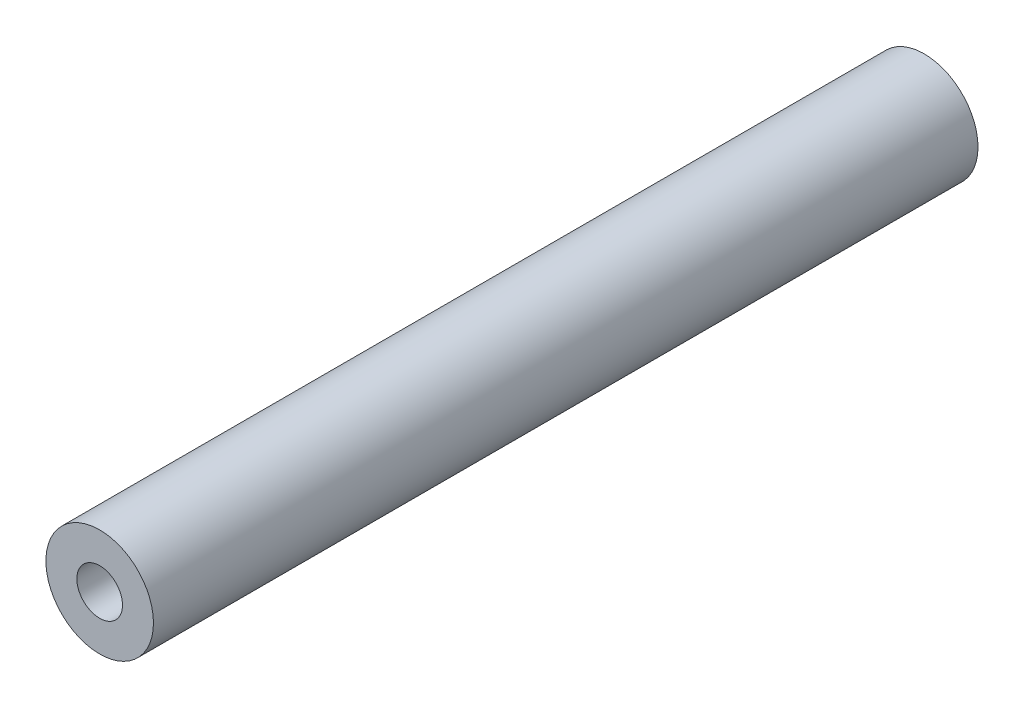
ISO-10303-21;
HEADER;
FILE_DESCRIPTION(('STEP AP214'),'2;1');
FILE_NAME('part.step','',(''),(''),'','','');
FILE_SCHEMA(('AUTOMOTIVE_DESIGN { 1 0 10303 214 1 1 1 1 }'));
ENDSEC;
DATA;
#1=APPLICATION_CONTEXT('core data for automotive mechanical design processes');
#2=APPLICATION_PROTOCOL_DEFINITION('international standard','automotive_design',2000,#1);
#3=PRODUCT_CONTEXT('',#1,'mechanical');
#4=PRODUCT('Part','Part','',(#3));
#5=PRODUCT_RELATED_PRODUCT_CATEGORY('part','',(#4));
#6=PRODUCT_DEFINITION_FORMATION('','',#4);
#7=PRODUCT_DEFINITION_CONTEXT('part definition',#1,'design');
#8=PRODUCT_DEFINITION('design','',#6,#7);
#9=PRODUCT_DEFINITION_SHAPE('','',#8);
#10=(LENGTH_UNIT() NAMED_UNIT(*) SI_UNIT(.MILLI.,.METRE.));
#11=(NAMED_UNIT(*) PLANE_ANGLE_UNIT() SI_UNIT($,.RADIAN.));
#12=(NAMED_UNIT(*) SI_UNIT($,.STERADIAN.) SOLID_ANGLE_UNIT());
#13=UNCERTAINTY_MEASURE_WITH_UNIT(LENGTH_MEASURE(1.E-05),#10,'distance_accuracy_value','');
#14=(GEOMETRIC_REPRESENTATION_CONTEXT(3) GLOBAL_UNCERTAINTY_ASSIGNED_CONTEXT((#13)) GLOBAL_UNIT_ASSIGNED_CONTEXT((#10,
#11,#12)) REPRESENTATION_CONTEXT('',''));
#15=CARTESIAN_POINT('',(0.,0.,0.));
#16=DIRECTION('',(0.,0.,1.));
#17=DIRECTION('',(1.,0.,0.));
#18=AXIS2_PLACEMENT_3D('',#15,#16,#17);
#19=CARTESIAN_POINT('',(0.,0.,36.5125));
#20=DIRECTION('',(0.,0.,-1.));
#21=DIRECTION('',(-1.,0.,0.));
#22=AXIS2_PLACEMENT_3D('',#19,#20,#21);
#23=CYLINDRICAL_SURFACE('',#22,4.7625);
#24=CARTESIAN_POINT('',(0.,0.,36.5125));
#25=DIRECTION('',(0.,0.,1.));
#26=DIRECTION('',(1.,0.,0.));
#27=AXIS2_PLACEMENT_3D('',#24,#25,#26);
#28=CIRCLE('',#27,4.7625);
#29=CARTESIAN_POINT('',(4.7625,0.,36.5125));
#30=VERTEX_POINT('',#29);
#31=EDGE_CURVE('E11',#30,#30,#28,.T.);
#32=ORIENTED_EDGE('',*,*,#31,.F.);
#33=EDGE_LOOP('',(#32));
#34=FACE_BOUND('',#33,.T.);
#35=CARTESIAN_POINT('',(0.,0.,-36.5125));
#36=DIRECTION('',(0.,0.,1.));
#37=DIRECTION('',(1.,0.,0.));
#38=AXIS2_PLACEMENT_3D('',#35,#36,#37);
#39=CIRCLE('',#38,4.7625);
#40=CARTESIAN_POINT('',(4.7625,0.,-36.5125));
#41=VERTEX_POINT('',#40);
#42=EDGE_CURVE('E58',#41,#41,#39,.T.);
#43=ORIENTED_EDGE('',*,*,#42,.T.);
#44=EDGE_LOOP('',(#43));
#45=FACE_BOUND('',#44,.T.);
#46=ADVANCED_FACE('F55',(#34,#45),#23,.T.);
#47=CARTESIAN_POINT('',(0.,0.,36.5125));
#48=DIRECTION('',(0.,0.,1.));
#49=DIRECTION('',(1.,0.,0.));
#50=AXIS2_PLACEMENT_3D('',#47,#48,#49);
#51=PLANE('',#50);
#52=CARTESIAN_POINT('',(0.,0.,36.5125));
#53=DIRECTION('',(0.,0.,1.));
#54=DIRECTION('',(1.,0.,0.));
#55=AXIS2_PLACEMENT_3D('',#52,#53,#54);
#56=CIRCLE('',#55,2.01929999999999);
#57=CARTESIAN_POINT('',(2.01929999999999,0.,36.5125));
#58=VERTEX_POINT('',#57);
#59=EDGE_CURVE('E80',#58,#58,#56,.T.);
#60=ORIENTED_EDGE('',*,*,#59,.F.);
#61=EDGE_LOOP('',(#60));
#62=FACE_BOUND('',#61,.T.);
#63=ORIENTED_EDGE('',*,*,#31,.T.);
#64=EDGE_LOOP('',(#63));
#65=FACE_BOUND('',#64,.T.);
#66=ADVANCED_FACE('F103',(#62,#65),#51,.T.);
#67=CARTESIAN_POINT('',(0.,0.,-36.5125));
#68=DIRECTION('',(0.,0.,1.));
#69=DIRECTION('',(1.,0.,0.));
#70=AXIS2_PLACEMENT_3D('',#67,#68,#69);
#71=PLANE('',#70);
#72=CARTESIAN_POINT('',(0.,0.,-36.5125));
#73=DIRECTION('',(0.,0.,-1.));
#74=DIRECTION('',(-1.,0.,0.));
#75=AXIS2_PLACEMENT_3D('',#72,#73,#74);
#76=CIRCLE('',#75,2.01929999999999);
#77=CARTESIAN_POINT('',(-2.01929999999999,0.,-36.5125));
#78=VERTEX_POINT('',#77);
#79=EDGE_CURVE('E81',#78,#78,#76,.T.);
#80=ORIENTED_EDGE('',*,*,#79,.F.);
#81=EDGE_LOOP('',(#80));
#82=FACE_BOUND('',#81,.T.);
#83=ORIENTED_EDGE('',*,*,#42,.F.);
#84=EDGE_LOOP('',(#83));
#85=FACE_BOUND('',#84,.T.);
#86=ADVANCED_FACE('F100',(#82,#85),#71,.F.);
#87=CARTESIAN_POINT('',(0.,0.,24.48306));
#88=DIRECTION('',(0.,0.,1.));
#89=DIRECTION('',(1.,0.,0.));
#90=AXIS2_PLACEMENT_3D('',#87,#88,#89);
#91=CONICAL_SURFACE('',#90,2.01929999999999,1.02974425867665);
#92=CARTESIAN_POINT('',(0.,0.,23.2697421519976));
#93=VERTEX_POINT('',#92);
#94=VERTEX_LOOP('',#93);
#95=FACE_BOUND('',#94,.T.);
#96=CARTESIAN_POINT('',(0.,0.,24.48306));
#97=DIRECTION('',(0.,0.,1.));
#98=DIRECTION('',(1.,0.,0.));
#99=AXIS2_PLACEMENT_3D('',#96,#97,#98);
#100=CIRCLE('',#99,2.01929999999999);
#101=CARTESIAN_POINT('',(2.01929999999999,0.,24.48306));
#102=VERTEX_POINT('',#101);
#103=EDGE_CURVE('E86',#102,#102,#100,.T.);
#104=ORIENTED_EDGE('',*,*,#103,.T.);
#105=EDGE_LOOP('',(#104));
#106=FACE_BOUND('',#105,.T.);
#107=ADVANCED_FACE('F102',(#95,#106),#91,.F.);
#108=CARTESIAN_POINT('',(0.,0.,36.5125));
#109=DIRECTION('',(0.,0.,1.));
#110=DIRECTION('',(1.,0.,0.));
#111=AXIS2_PLACEMENT_3D('',#108,#109,#110);
#112=CYLINDRICAL_SURFACE('',#111,2.01929999999999);
#113=ORIENTED_EDGE('',*,*,#103,.F.);
#114=EDGE_LOOP('',(#113));
#115=FACE_BOUND('',#114,.T.);
#116=ORIENTED_EDGE('',*,*,#59,.T.);
#117=EDGE_LOOP('',(#116));
#118=FACE_BOUND('',#117,.T.);
#119=ADVANCED_FACE('F73',(#115,#118),#112,.F.);
#120=CARTESIAN_POINT('',(0.,0.,-24.48306));
#121=DIRECTION('',(0.,0.,-1.));
#122=DIRECTION('',(-1.,0.,0.));
#123=AXIS2_PLACEMENT_3D('',#120,#121,#122);
#124=CONICAL_SURFACE('',#123,2.01929999999999,1.02974425867665);
#125=CARTESIAN_POINT('',(0.,0.,-23.2697421519976));
#126=VERTEX_POINT('',#125);
#127=VERTEX_LOOP('',#126);
#128=FACE_BOUND('',#127,.T.);
#129=CARTESIAN_POINT('',(0.,0.,-24.48306));
#130=DIRECTION('',(0.,0.,-1.));
#131=DIRECTION('',(-1.,0.,0.));
#132=AXIS2_PLACEMENT_3D('',#129,#130,#131);
#133=CIRCLE('',#132,2.01929999999999);
#134=CARTESIAN_POINT('',(-2.01929999999999,0.,-24.48306));
#135=VERTEX_POINT('',#134);
#136=EDGE_CURVE('E77',#135,#135,#133,.T.);
#137=ORIENTED_EDGE('',*,*,#136,.T.);
#138=EDGE_LOOP('',(#137));
#139=FACE_BOUND('',#138,.T.);
#140=ADVANCED_FACE('F69',(#128,#139),#124,.F.);
#141=CARTESIAN_POINT('',(0.,0.,-36.5125));
#142=DIRECTION('',(0.,0.,-1.));
#143=DIRECTION('',(-1.,0.,0.));
#144=AXIS2_PLACEMENT_3D('',#141,#142,#143);
#145=CYLINDRICAL_SURFACE('',#144,2.01929999999999);
#146=ORIENTED_EDGE('',*,*,#136,.F.);
#147=EDGE_LOOP('',(#146));
#148=FACE_BOUND('',#147,.T.);
#149=ORIENTED_EDGE('',*,*,#79,.T.);
#150=EDGE_LOOP('',(#149));
#151=FACE_BOUND('',#150,.T.);
#152=ADVANCED_FACE('F72',(#148,#151),#145,.F.);
#153=CLOSED_SHELL('',(#46,#66,#86,#107,#119,#140,#152));
#154=MANIFOLD_SOLID_BREP('B2',#153);
#155=ADVANCED_BREP_SHAPE_REPRESENTATION('',(#18,#154),#14);
#156=SHAPE_DEFINITION_REPRESENTATION(#9,#155);
ENDSEC;
END-ISO-10303-21;
